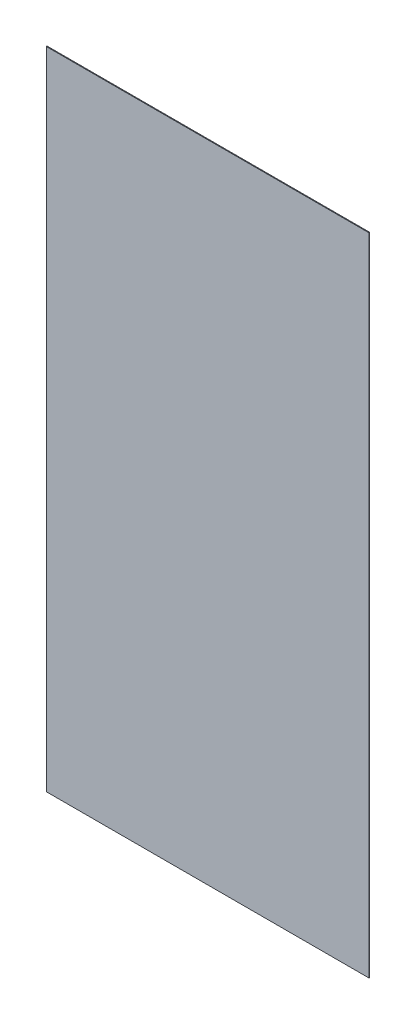
ISO-10303-21;
HEADER;
FILE_DESCRIPTION(('STEP AP214'),'2;1');
FILE_NAME('part.step','',(''),(''),'','','');
FILE_SCHEMA(('AUTOMOTIVE_DESIGN { 1 0 10303 214 1 1 1 1 }'));
ENDSEC;
DATA;
#1=APPLICATION_CONTEXT('core data for automotive mechanical design processes');
#2=APPLICATION_PROTOCOL_DEFINITION('international standard','automotive_design',2000,#1);
#3=PRODUCT_CONTEXT('',#1,'mechanical');
#4=PRODUCT('Part','Part','',(#3));
#5=PRODUCT_RELATED_PRODUCT_CATEGORY('part','',(#4));
#6=PRODUCT_DEFINITION_FORMATION('','',#4);
#7=PRODUCT_DEFINITION_CONTEXT('part definition',#1,'design');
#8=PRODUCT_DEFINITION('design','',#6,#7);
#9=PRODUCT_DEFINITION_SHAPE('','',#8);
#10=(LENGTH_UNIT() NAMED_UNIT(*) SI_UNIT(.MILLI.,.METRE.));
#11=(NAMED_UNIT(*) PLANE_ANGLE_UNIT() SI_UNIT($,.RADIAN.));
#12=(NAMED_UNIT(*) SI_UNIT($,.STERADIAN.) SOLID_ANGLE_UNIT());
#13=UNCERTAINTY_MEASURE_WITH_UNIT(LENGTH_MEASURE(1.E-05),#10,'distance_accuracy_value','');
#14=(GEOMETRIC_REPRESENTATION_CONTEXT(3) GLOBAL_UNCERTAINTY_ASSIGNED_CONTEXT((#13)) GLOBAL_UNIT_ASSIGNED_CONTEXT((#10,
#11,#12)) REPRESENTATION_CONTEXT('',''));
#15=CARTESIAN_POINT('',(0.,0.,0.));
#16=DIRECTION('',(0.,0.,1.));
#17=DIRECTION('',(1.,0.,0.));
#18=AXIS2_PLACEMENT_3D('',#15,#16,#17);
#19=CARTESIAN_POINT('',(609.6,1219.2,2.9972));
#20=DIRECTION('',(-1.,0.,0.));
#21=DIRECTION('',(0.,-1.,0.));
#22=AXIS2_PLACEMENT_3D('',#19,#20,#21);
#23=PLANE('',#22);
#24=DIRECTION('',(0.,1.,0.));
#25=VECTOR('',#24,1.);
#26=CARTESIAN_POINT('',(609.6,1219.2,0.));
#27=LINE('',#26,#25);
#28=CARTESIAN_POINT('',(609.6,-1219.2,0.));
#29=VERTEX_POINT('',#28);
#30=CARTESIAN_POINT('',(609.6,1219.2,0.));
#31=VERTEX_POINT('',#30);
#32=EDGE_CURVE('E100',#29,#31,#27,.T.);
#33=ORIENTED_EDGE('',*,*,#32,.T.);
#34=DIRECTION('',(0.,0.,-1.));
#35=VECTOR('',#34,1.);
#36=CARTESIAN_POINT('',(609.6,1219.2,2.9972));
#37=LINE('',#36,#35);
#38=CARTESIAN_POINT('',(609.6,1219.2,2.9972));
#39=VERTEX_POINT('',#38);
#40=EDGE_CURVE('E11',#39,#31,#37,.T.);
#41=ORIENTED_EDGE('',*,*,#40,.F.);
#42=DIRECTION('',(0.,1.,0.));
#43=VECTOR('',#42,1.);
#44=CARTESIAN_POINT('',(609.6,1219.2,2.9972));
#45=LINE('',#44,#43);
#46=CARTESIAN_POINT('',(609.6,-1219.2,2.9972));
#47=VERTEX_POINT('',#46);
#48=EDGE_CURVE('E88',#47,#39,#45,.T.);
#49=ORIENTED_EDGE('',*,*,#48,.F.);
#50=DIRECTION('',(0.,0.,-1.));
#51=VECTOR('',#50,1.);
#52=CARTESIAN_POINT('',(609.6,-1219.2,2.9972));
#53=LINE('',#52,#51);
#54=EDGE_CURVE('E96',#47,#29,#53,.T.);
#55=ORIENTED_EDGE('',*,*,#54,.T.);
#56=EDGE_LOOP('',(#33,#41,#49,#55));
#57=FACE_BOUND('',#56,.T.);
#58=ADVANCED_FACE('F37',(#57),#23,.F.);
#59=CARTESIAN_POINT('',(-609.6,1219.2,2.9972));
#60=DIRECTION('',(0.,-1.,0.));
#61=DIRECTION('',(0.,0.,-1.));
#62=AXIS2_PLACEMENT_3D('',#59,#60,#61);
#63=PLANE('',#62);
#64=DIRECTION('',(-1.,0.,0.));
#65=VECTOR('',#64,1.);
#66=CARTESIAN_POINT('',(-609.6,1219.2,0.));
#67=LINE('',#66,#65);
#68=CARTESIAN_POINT('',(-609.6,1219.2,0.));
#69=VERTEX_POINT('',#68);
#70=EDGE_CURVE('E92',#31,#69,#67,.T.);
#71=ORIENTED_EDGE('',*,*,#70,.T.);
#72=DIRECTION('',(0.,0.,-1.));
#73=VECTOR('',#72,1.);
#74=CARTESIAN_POINT('',(-609.6,1219.2,2.9972));
#75=LINE('',#74,#73);
#76=CARTESIAN_POINT('',(-609.6,1219.2,2.9972));
#77=VERTEX_POINT('',#76);
#78=EDGE_CURVE('E45',#77,#69,#75,.T.);
#79=ORIENTED_EDGE('',*,*,#78,.F.);
#80=DIRECTION('',(-1.,0.,0.));
#81=VECTOR('',#80,1.);
#82=CARTESIAN_POINT('',(-609.6,1219.2,2.9972));
#83=LINE('',#82,#81);
#84=EDGE_CURVE('E83',#39,#77,#83,.T.);
#85=ORIENTED_EDGE('',*,*,#84,.F.);
#86=ORIENTED_EDGE('',*,*,#40,.T.);
#87=EDGE_LOOP('',(#71,#79,#85,#86));
#88=FACE_BOUND('',#87,.T.);
#89=ADVANCED_FACE('F91',(#88),#63,.F.);
#90=CARTESIAN_POINT('',(-609.6,1219.2,2.9972));
#91=DIRECTION('',(1.,0.,0.));
#92=DIRECTION('',(0.,1.,0.));
#93=AXIS2_PLACEMENT_3D('',#90,#91,#92);
#94=PLANE('',#93);
#95=DIRECTION('',(0.,-1.,0.));
#96=VECTOR('',#95,1.);
#97=CARTESIAN_POINT('',(-609.6,1219.2,0.));
#98=LINE('',#97,#96);
#99=CARTESIAN_POINT('',(-609.6,-1219.2,0.));
#100=VERTEX_POINT('',#99);
#101=EDGE_CURVE('E70',#69,#100,#98,.T.);
#102=ORIENTED_EDGE('',*,*,#101,.T.);
#103=DIRECTION('',(0.,0.,-1.));
#104=VECTOR('',#103,1.);
#105=CARTESIAN_POINT('',(-609.6,-1219.2,2.9972));
#106=LINE('',#105,#104);
#107=CARTESIAN_POINT('',(-609.6,-1219.2,2.9972));
#108=VERTEX_POINT('',#107);
#109=EDGE_CURVE('E93',#108,#100,#106,.T.);
#110=ORIENTED_EDGE('',*,*,#109,.F.);
#111=DIRECTION('',(0.,-1.,0.));
#112=VECTOR('',#111,1.);
#113=CARTESIAN_POINT('',(-609.6,1219.2,2.9972));
#114=LINE('',#113,#112);
#115=EDGE_CURVE('E86',#77,#108,#114,.T.);
#116=ORIENTED_EDGE('',*,*,#115,.F.);
#117=ORIENTED_EDGE('',*,*,#78,.T.);
#118=EDGE_LOOP('',(#102,#110,#116,#117));
#119=FACE_BOUND('',#118,.T.);
#120=ADVANCED_FACE('F94',(#119),#94,.F.);
#121=CARTESIAN_POINT('',(-609.6,-1219.2,2.9972));
#122=DIRECTION('',(0.,1.,0.));
#123=DIRECTION('',(0.,0.,1.));
#124=AXIS2_PLACEMENT_3D('',#121,#122,#123);
#125=PLANE('',#124);
#126=DIRECTION('',(1.,0.,0.));
#127=VECTOR('',#126,1.);
#128=CARTESIAN_POINT('',(-609.6,-1219.2,0.));
#129=LINE('',#128,#127);
#130=EDGE_CURVE('E76',#100,#29,#129,.T.);
#131=ORIENTED_EDGE('',*,*,#130,.T.);
#132=ORIENTED_EDGE('',*,*,#54,.F.);
#133=DIRECTION('',(1.,0.,0.));
#134=VECTOR('',#133,1.);
#135=CARTESIAN_POINT('',(-609.6,-1219.2,2.9972));
#136=LINE('',#135,#134);
#137=EDGE_CURVE('E53',#108,#47,#136,.T.);
#138=ORIENTED_EDGE('',*,*,#137,.F.);
#139=ORIENTED_EDGE('',*,*,#109,.T.);
#140=EDGE_LOOP('',(#131,#132,#138,#139));
#141=FACE_BOUND('',#140,.T.);
#142=ADVANCED_FACE('F107',(#141),#125,.F.);
#143=CARTESIAN_POINT('',(0.,0.,2.9972));
#144=DIRECTION('',(0.,0.,1.));
#145=DIRECTION('',(1.,0.,0.));
#146=AXIS2_PLACEMENT_3D('',#143,#144,#145);
#147=PLANE('',#146);
#148=ORIENTED_EDGE('',*,*,#48,.T.);
#149=ORIENTED_EDGE('',*,*,#84,.T.);
#150=ORIENTED_EDGE('',*,*,#115,.T.);
#151=ORIENTED_EDGE('',*,*,#137,.T.);
#152=EDGE_LOOP('',(#148,#149,#150,#151));
#153=FACE_BOUND('',#152,.T.);
#154=ADVANCED_FACE('F84',(#153),#147,.T.);
#155=CARTESIAN_POINT('',(0.,0.,0.));
#156=DIRECTION('',(0.,0.,1.));
#157=DIRECTION('',(1.,0.,0.));
#158=AXIS2_PLACEMENT_3D('',#155,#156,#157);
#159=PLANE('',#158);
#160=ORIENTED_EDGE('',*,*,#32,.F.);
#161=ORIENTED_EDGE('',*,*,#130,.F.);
#162=ORIENTED_EDGE('',*,*,#101,.F.);
#163=ORIENTED_EDGE('',*,*,#70,.F.);
#164=EDGE_LOOP('',(#160,#161,#162,#163));
#165=FACE_BOUND('',#164,.T.);
#166=ADVANCED_FACE('F110',(#165),#159,.F.);
#167=CLOSED_SHELL('',(#58,#89,#120,#142,#154,#166));
#168=MANIFOLD_SOLID_BREP('B2',#167);
#169=ADVANCED_BREP_SHAPE_REPRESENTATION('',(#18,#168),#14);
#170=SHAPE_DEFINITION_REPRESENTATION(#9,#169);
ENDSEC;
END-ISO-10303-21;
